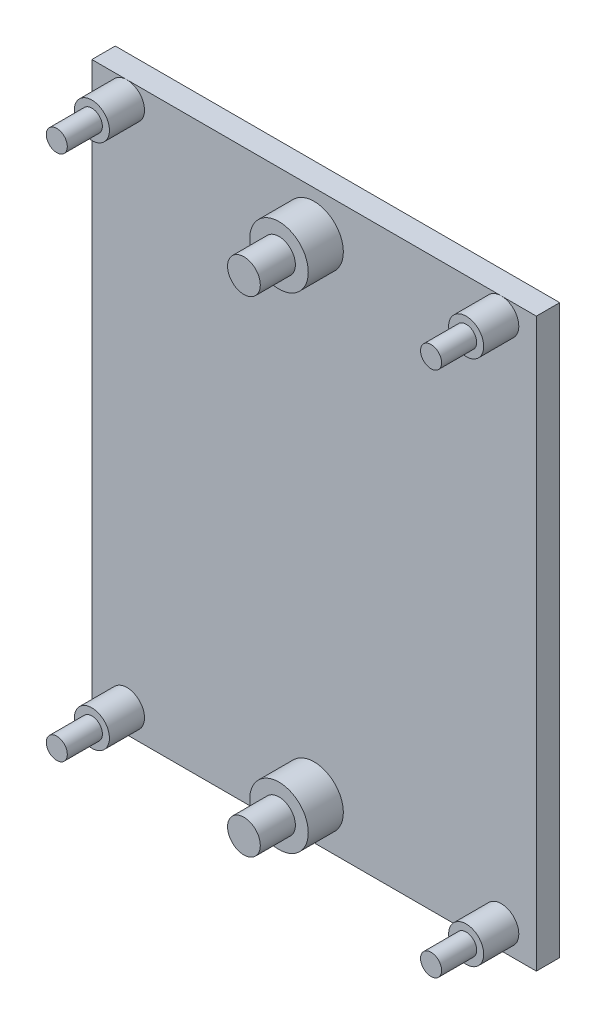
ISO-10303-21;
HEADER;
FILE_DESCRIPTION(('STEP AP214'),'2;1');
FILE_NAME('part.step','',(''),(''),'','','');
FILE_SCHEMA(('AUTOMOTIVE_DESIGN { 1 0 10303 214 1 1 1 1 }'));
ENDSEC;
DATA;
#1=APPLICATION_CONTEXT('core data for automotive mechanical design processes');
#2=APPLICATION_PROTOCOL_DEFINITION('international standard','automotive_design',2000,#1);
#3=PRODUCT_CONTEXT('',#1,'mechanical');
#4=PRODUCT('Part','Part','',(#3));
#5=PRODUCT_RELATED_PRODUCT_CATEGORY('part','',(#4));
#6=PRODUCT_DEFINITION_FORMATION('','',#4);
#7=PRODUCT_DEFINITION_CONTEXT('part definition',#1,'design');
#8=PRODUCT_DEFINITION('design','',#6,#7);
#9=PRODUCT_DEFINITION_SHAPE('','',#8);
#10=(LENGTH_UNIT() NAMED_UNIT(*) SI_UNIT(.MILLI.,.METRE.));
#11=(NAMED_UNIT(*) PLANE_ANGLE_UNIT() SI_UNIT($,.RADIAN.));
#12=(NAMED_UNIT(*) SI_UNIT($,.STERADIAN.) SOLID_ANGLE_UNIT());
#13=UNCERTAINTY_MEASURE_WITH_UNIT(LENGTH_MEASURE(1.E-05),#10,'distance_accuracy_value','');
#14=(GEOMETRIC_REPRESENTATION_CONTEXT(3) GLOBAL_UNCERTAINTY_ASSIGNED_CONTEXT((#13)) GLOBAL_UNIT_ASSIGNED_CONTEXT((#10,
#11,#12)) REPRESENTATION_CONTEXT('',''));
#15=CARTESIAN_POINT('',(0.,0.,0.));
#16=DIRECTION('',(0.,0.,1.));
#17=DIRECTION('',(1.,0.,0.));
#18=AXIS2_PLACEMENT_3D('',#15,#16,#17);
#19=CARTESIAN_POINT('',(19.,-24.25,2.));
#20=DIRECTION('',(-1.,0.,0.));
#21=DIRECTION('',(0.,0.,1.));
#22=AXIS2_PLACEMENT_3D('',#19,#20,#21);
#23=PLANE('',#22);
#24=DIRECTION('',(0.,1.,0.));
#25=VECTOR('',#24,1.);
#26=CARTESIAN_POINT('',(19.,-24.25,0.));
#27=LINE('',#26,#25);
#28=CARTESIAN_POINT('',(19.,-24.25,0.));
#29=VERTEX_POINT('',#28);
#30=CARTESIAN_POINT('',(19.,24.25,0.));
#31=VERTEX_POINT('',#30);
#32=EDGE_CURVE('E127',#29,#31,#27,.T.);
#33=ORIENTED_EDGE('',*,*,#32,.T.);
#34=DIRECTION('',(0.,0.,-1.));
#35=VECTOR('',#34,1.);
#36=CARTESIAN_POINT('',(19.,24.25,2.));
#37=LINE('',#36,#35);
#38=CARTESIAN_POINT('',(19.,24.25,2.));
#39=VERTEX_POINT('',#38);
#40=EDGE_CURVE('E46',#39,#31,#37,.T.);
#41=ORIENTED_EDGE('',*,*,#40,.F.);
#42=DIRECTION('',(0.,1.,0.));
#43=VECTOR('',#42,1.);
#44=CARTESIAN_POINT('',(19.,-24.25,2.));
#45=LINE('',#44,#43);
#46=CARTESIAN_POINT('',(19.,-24.25,2.));
#47=VERTEX_POINT('',#46);
#48=EDGE_CURVE('E112',#47,#39,#45,.T.);
#49=ORIENTED_EDGE('',*,*,#48,.F.);
#50=DIRECTION('',(0.,0.,-1.));
#51=VECTOR('',#50,1.);
#52=CARTESIAN_POINT('',(19.,-24.25,2.));
#53=LINE('',#52,#51);
#54=EDGE_CURVE('E62',#47,#29,#53,.T.);
#55=ORIENTED_EDGE('',*,*,#54,.T.);
#56=EDGE_LOOP('',(#33,#41,#49,#55));
#57=FACE_BOUND('',#56,.T.);
#58=ADVANCED_FACE('F43',(#57),#23,.F.);
#59=CARTESIAN_POINT('',(19.,24.25,2.));
#60=DIRECTION('',(0.,-1.,0.));
#61=DIRECTION('',(0.,0.,-1.));
#62=AXIS2_PLACEMENT_3D('',#59,#60,#61);
#63=PLANE('',#62);
#64=DIRECTION('',(-1.,0.,0.));
#65=VECTOR('',#64,1.);
#66=CARTESIAN_POINT('',(19.,24.25,0.));
#67=LINE('',#66,#65);
#68=CARTESIAN_POINT('',(-19.,24.25,0.));
#69=VERTEX_POINT('',#68);
#70=EDGE_CURVE('E129',#31,#69,#67,.T.);
#71=ORIENTED_EDGE('',*,*,#70,.T.);
#72=DIRECTION('',(0.,0.,-1.));
#73=VECTOR('',#72,1.);
#74=CARTESIAN_POINT('',(-19.,24.25,2.));
#75=LINE('',#74,#73);
#76=CARTESIAN_POINT('',(-19.,24.25,2.));
#77=VERTEX_POINT('',#76);
#78=EDGE_CURVE('E111',#77,#69,#75,.T.);
#79=ORIENTED_EDGE('',*,*,#78,.F.);
#80=DIRECTION('',(-1.,0.,0.));
#81=VECTOR('',#80,1.);
#82=CARTESIAN_POINT('',(19.,24.25,2.));
#83=LINE('',#82,#81);
#84=CARTESIAN_POINT('',(-16.,24.25,2.));
#85=VERTEX_POINT('',#84);
#86=EDGE_CURVE('E106',#85,#77,#83,.T.);
#87=ORIENTED_EDGE('',*,*,#86,.F.);
#88=CARTESIAN_POINT('',(16.,24.25,2.));
#89=VERTEX_POINT('',#88);
#90=EDGE_CURVE('E96',#89,#85,#83,.T.);
#91=ORIENTED_EDGE('',*,*,#90,.F.);
#92=EDGE_CURVE('E90',#39,#89,#83,.T.);
#93=ORIENTED_EDGE('',*,*,#92,.F.);
#94=ORIENTED_EDGE('',*,*,#40,.T.);
#95=EDGE_LOOP('',(#71,#79,#87,#91,#93,#94));
#96=FACE_BOUND('',#95,.T.);
#97=ADVANCED_FACE('F109',(#96),#63,.F.);
#98=CARTESIAN_POINT('',(-19.,-24.25,2.));
#99=DIRECTION('',(-1.,0.,0.));
#100=DIRECTION('',(0.,0.,1.));
#101=AXIS2_PLACEMENT_3D('',#98,#99,#100);
#102=PLANE('',#101);
#103=DIRECTION('',(0.,1.,0.));
#104=VECTOR('',#103,1.);
#105=CARTESIAN_POINT('',(-19.,-24.25,0.));
#106=LINE('',#105,#104);
#107=CARTESIAN_POINT('',(-19.,-24.25,0.));
#108=VERTEX_POINT('',#107);
#109=EDGE_CURVE('E131',#108,#69,#106,.T.);
#110=ORIENTED_EDGE('',*,*,#109,.F.);
#111=DIRECTION('',(0.,0.,-1.));
#112=VECTOR('',#111,1.);
#113=CARTESIAN_POINT('',(-19.,-24.25,2.));
#114=LINE('',#113,#112);
#115=CARTESIAN_POINT('',(-19.,-24.25,2.));
#116=VERTEX_POINT('',#115);
#117=EDGE_CURVE('E77',#116,#108,#114,.T.);
#118=ORIENTED_EDGE('',*,*,#117,.F.);
#119=DIRECTION('',(0.,1.,0.));
#120=VECTOR('',#119,1.);
#121=CARTESIAN_POINT('',(-19.,-24.25,2.));
#122=LINE('',#121,#120);
#123=EDGE_CURVE('E117',#116,#77,#122,.T.);
#124=ORIENTED_EDGE('',*,*,#123,.T.);
#125=ORIENTED_EDGE('',*,*,#78,.T.);
#126=EDGE_LOOP('',(#110,#118,#124,#125));
#127=FACE_BOUND('',#126,.T.);
#128=ADVANCED_FACE('F256',(#127),#102,.T.);
#129=CARTESIAN_POINT('',(19.,-24.25,2.));
#130=DIRECTION('',(0.,-1.,0.));
#131=DIRECTION('',(0.,0.,-1.));
#132=AXIS2_PLACEMENT_3D('',#129,#130,#131);
#133=PLANE('',#132);
#134=DIRECTION('',(-1.,0.,0.));
#135=VECTOR('',#134,1.);
#136=CARTESIAN_POINT('',(19.,-24.25,0.));
#137=LINE('',#136,#135);
#138=EDGE_CURVE('E114',#29,#108,#137,.T.);
#139=ORIENTED_EDGE('',*,*,#138,.F.);
#140=ORIENTED_EDGE('',*,*,#54,.F.);
#141=DIRECTION('',(-1.,0.,0.));
#142=VECTOR('',#141,1.);
#143=CARTESIAN_POINT('',(19.,-24.25,2.));
#144=LINE('',#143,#142);
#145=EDGE_CURVE('E119',#47,#116,#144,.T.);
#146=ORIENTED_EDGE('',*,*,#145,.T.);
#147=ORIENTED_EDGE('',*,*,#117,.T.);
#148=EDGE_LOOP('',(#139,#140,#146,#147));
#149=FACE_BOUND('',#148,.T.);
#150=ADVANCED_FACE('F227',(#149),#133,.T.);
#151=CARTESIAN_POINT('',(0.,0.,2.));
#152=DIRECTION('',(0.,0.,1.));
#153=DIRECTION('',(1.,0.,0.));
#154=AXIS2_PLACEMENT_3D('',#151,#152,#153);
#155=PLANE('',#154);
#156=CARTESIAN_POINT('',(16.,-22.25,2.));
#157=DIRECTION('',(0.,0.,1.));
#158=DIRECTION('',(1.,0.,0.));
#159=AXIS2_PLACEMENT_3D('',#156,#157,#158);
#160=CIRCLE('',#159,1.5);
#161=CARTESIAN_POINT('',(17.5,-22.25,2.));
#162=VERTEX_POINT('',#161);
#163=EDGE_CURVE('E157',#162,#162,#160,.T.);
#164=ORIENTED_EDGE('',*,*,#163,.F.);
#165=EDGE_LOOP('',(#164));
#166=FACE_BOUND('',#165,.T.);
#167=CARTESIAN_POINT('',(0.,-20.75,2.));
#168=DIRECTION('',(0.,0.,1.));
#169=DIRECTION('',(1.,0.,0.));
#170=AXIS2_PLACEMENT_3D('',#167,#168,#169);
#171=CIRCLE('',#170,2.5);
#172=CARTESIAN_POINT('',(2.5,-20.75,2.));
#173=VERTEX_POINT('',#172);
#174=EDGE_CURVE('E150',#173,#173,#171,.T.);
#175=ORIENTED_EDGE('',*,*,#174,.F.);
#176=EDGE_LOOP('',(#175));
#177=FACE_BOUND('',#176,.T.);
#178=CARTESIAN_POINT('',(0.,20.75,2.));
#179=DIRECTION('',(0.,0.,1.));
#180=DIRECTION('',(1.,0.,0.));
#181=AXIS2_PLACEMENT_3D('',#178,#179,#180);
#182=CIRCLE('',#181,2.5);
#183=CARTESIAN_POINT('',(2.5,20.75,2.));
#184=VERTEX_POINT('',#183);
#185=EDGE_CURVE('E145',#184,#184,#182,.T.);
#186=ORIENTED_EDGE('',*,*,#185,.F.);
#187=EDGE_LOOP('',(#186));
#188=FACE_BOUND('',#187,.T.);
#189=CARTESIAN_POINT('',(-16.,-22.25,2.));
#190=DIRECTION('',(0.,0.,1.));
#191=DIRECTION('',(1.,0.,0.));
#192=AXIS2_PLACEMENT_3D('',#189,#190,#191);
#193=CIRCLE('',#192,1.5);
#194=CARTESIAN_POINT('',(-14.5,-22.25,2.));
#195=VERTEX_POINT('',#194);
#196=EDGE_CURVE('E139',#195,#195,#193,.T.);
#197=ORIENTED_EDGE('',*,*,#196,.F.);
#198=EDGE_LOOP('',(#197));
#199=FACE_BOUND('',#198,.T.);
#200=ORIENTED_EDGE('',*,*,#92,.T.);
#201=CARTESIAN_POINT('',(16.,22.75,2.));
#202=DIRECTION('',(0.,0.,1.));
#203=DIRECTION('',(1.,0.,0.));
#204=AXIS2_PLACEMENT_3D('',#201,#202,#203);
#205=CIRCLE('',#204,1.5);
#206=EDGE_CURVE('E104',#89,#89,#205,.T.);
#207=ORIENTED_EDGE('',*,*,#206,.F.);
#208=ORIENTED_EDGE('',*,*,#90,.T.);
#209=CARTESIAN_POINT('',(-16.,22.75,2.));
#210=DIRECTION('',(0.,0.,1.));
#211=DIRECTION('',(1.,0.,0.));
#212=AXIS2_PLACEMENT_3D('',#209,#210,#211);
#213=CIRCLE('',#212,1.5);
#214=EDGE_CURVE('E105',#85,#85,#213,.T.);
#215=ORIENTED_EDGE('',*,*,#214,.F.);
#216=ORIENTED_EDGE('',*,*,#86,.T.);
#217=ORIENTED_EDGE('',*,*,#123,.F.);
#218=ORIENTED_EDGE('',*,*,#145,.F.);
#219=ORIENTED_EDGE('',*,*,#48,.T.);
#220=EDGE_LOOP('',(#200,#207,#208,#215,#216,#217,#218,#219));
#221=FACE_BOUND('',#220,.T.);
#222=ADVANCED_FACE('F99',(#166,#177,#188,#199,#221),#155,.T.);
#223=CARTESIAN_POINT('',(0.,0.,0.));
#224=DIRECTION('',(0.,0.,1.));
#225=DIRECTION('',(1.,0.,0.));
#226=AXIS2_PLACEMENT_3D('',#223,#224,#225);
#227=PLANE('',#226);
#228=ORIENTED_EDGE('',*,*,#32,.F.);
#229=ORIENTED_EDGE('',*,*,#138,.T.);
#230=ORIENTED_EDGE('',*,*,#109,.T.);
#231=ORIENTED_EDGE('',*,*,#70,.F.);
#232=EDGE_LOOP('',(#228,#229,#230,#231));
#233=FACE_BOUND('',#232,.T.);
#234=ADVANCED_FACE('F228',(#233),#227,.F.);
#235=CARTESIAN_POINT('',(-16.,-22.25,5.));
#236=DIRECTION('',(0.,0.,-1.));
#237=DIRECTION('',(-1.,0.,0.));
#238=AXIS2_PLACEMENT_3D('',#235,#236,#237);
#239=CYLINDRICAL_SURFACE('',#238,1.5);
#240=CARTESIAN_POINT('',(-16.,-22.25,5.));
#241=DIRECTION('',(0.,0.,1.));
#242=DIRECTION('',(1.,0.,0.));
#243=AXIS2_PLACEMENT_3D('',#240,#241,#242);
#244=CIRCLE('',#243,1.5);
#245=CARTESIAN_POINT('',(-14.5,-22.25,5.));
#246=VERTEX_POINT('',#245);
#247=EDGE_CURVE('E126',#246,#246,#244,.T.);
#248=ORIENTED_EDGE('',*,*,#247,.F.);
#249=EDGE_LOOP('',(#248));
#250=FACE_BOUND('',#249,.T.);
#251=ORIENTED_EDGE('',*,*,#196,.T.);
#252=EDGE_LOOP('',(#251));
#253=FACE_BOUND('',#252,.T.);
#254=ADVANCED_FACE('F248',(#250,#253),#239,.T.);
#255=CARTESIAN_POINT('',(-16.,-22.25,5.));
#256=DIRECTION('',(0.,0.,1.));
#257=DIRECTION('',(1.,0.,0.));
#258=AXIS2_PLACEMENT_3D('',#255,#256,#257);
#259=PLANE('',#258);
#260=CARTESIAN_POINT('',(-16.,-22.25,5.));
#261=DIRECTION('',(0.,0.,1.));
#262=DIRECTION('',(1.,0.,0.));
#263=AXIS2_PLACEMENT_3D('',#260,#261,#262);
#264=CIRCLE('',#263,0.900000000000002);
#265=CARTESIAN_POINT('',(-15.1,-22.25,5.));
#266=VERTEX_POINT('',#265);
#267=EDGE_CURVE('E11',#266,#266,#264,.T.);
#268=ORIENTED_EDGE('',*,*,#267,.F.);
#269=EDGE_LOOP('',(#268));
#270=FACE_BOUND('',#269,.T.);
#271=ORIENTED_EDGE('',*,*,#247,.T.);
#272=EDGE_LOOP('',(#271));
#273=FACE_BOUND('',#272,.T.);
#274=ADVANCED_FACE('F240',(#270,#273),#259,.T.);
#275=CARTESIAN_POINT('',(0.,20.75,5.));
#276=DIRECTION('',(0.,0.,-1.));
#277=DIRECTION('',(-1.,0.,0.));
#278=AXIS2_PLACEMENT_3D('',#275,#276,#277);
#279=CYLINDRICAL_SURFACE('',#278,2.5);
#280=CARTESIAN_POINT('',(0.,20.75,5.));
#281=DIRECTION('',(0.,0.,1.));
#282=DIRECTION('',(1.,0.,0.));
#283=AXIS2_PLACEMENT_3D('',#280,#281,#282);
#284=CIRCLE('',#283,2.5);
#285=CARTESIAN_POINT('',(2.5,20.75,5.));
#286=VERTEX_POINT('',#285);
#287=EDGE_CURVE('E160',#286,#286,#284,.T.);
#288=ORIENTED_EDGE('',*,*,#287,.F.);
#289=EDGE_LOOP('',(#288));
#290=FACE_BOUND('',#289,.T.);
#291=ORIENTED_EDGE('',*,*,#185,.T.);
#292=EDGE_LOOP('',(#291));
#293=FACE_BOUND('',#292,.T.);
#294=ADVANCED_FACE('F234',(#290,#293),#279,.T.);
#295=CARTESIAN_POINT('',(0.,20.75,5.));
#296=DIRECTION('',(0.,0.,1.));
#297=DIRECTION('',(1.,0.,0.));
#298=AXIS2_PLACEMENT_3D('',#295,#296,#297);
#299=PLANE('',#298);
#300=CARTESIAN_POINT('',(0.,20.75,5.));
#301=DIRECTION('',(0.,0.,1.));
#302=DIRECTION('',(1.,0.,0.));
#303=AXIS2_PLACEMENT_3D('',#300,#301,#302);
#304=CIRCLE('',#303,1.4);
#305=CARTESIAN_POINT('',(1.4,20.75,5.));
#306=VERTEX_POINT('',#305);
#307=EDGE_CURVE('E55',#306,#306,#304,.T.);
#308=ORIENTED_EDGE('',*,*,#307,.F.);
#309=EDGE_LOOP('',(#308));
#310=FACE_BOUND('',#309,.T.);
#311=ORIENTED_EDGE('',*,*,#287,.T.);
#312=EDGE_LOOP('',(#311));
#313=FACE_BOUND('',#312,.T.);
#314=ADVANCED_FACE('F236',(#310,#313),#299,.T.);
#315=CARTESIAN_POINT('',(0.,-20.75,5.));
#316=DIRECTION('',(0.,0.,-1.));
#317=DIRECTION('',(-1.,0.,0.));
#318=AXIS2_PLACEMENT_3D('',#315,#316,#317);
#319=CYLINDRICAL_SURFACE('',#318,2.5);
#320=CARTESIAN_POINT('',(0.,-20.75,5.));
#321=DIRECTION('',(0.,0.,1.));
#322=DIRECTION('',(1.,0.,0.));
#323=AXIS2_PLACEMENT_3D('',#320,#321,#322);
#324=CIRCLE('',#323,2.5);
#325=CARTESIAN_POINT('',(2.5,-20.75,5.));
#326=VERTEX_POINT('',#325);
#327=EDGE_CURVE('E155',#326,#326,#324,.T.);
#328=ORIENTED_EDGE('',*,*,#327,.F.);
#329=EDGE_LOOP('',(#328));
#330=FACE_BOUND('',#329,.T.);
#331=ORIENTED_EDGE('',*,*,#174,.T.);
#332=EDGE_LOOP('',(#331));
#333=FACE_BOUND('',#332,.T.);
#334=ADVANCED_FACE('F244',(#330,#333),#319,.T.);
#335=CARTESIAN_POINT('',(0.,-20.75,5.));
#336=DIRECTION('',(0.,0.,1.));
#337=DIRECTION('',(1.,0.,0.));
#338=AXIS2_PLACEMENT_3D('',#335,#336,#337);
#339=PLANE('',#338);
#340=CARTESIAN_POINT('',(0.,-20.75,5.));
#341=DIRECTION('',(0.,0.,1.));
#342=DIRECTION('',(1.,0.,0.));
#343=AXIS2_PLACEMENT_3D('',#340,#341,#342);
#344=CIRCLE('',#343,1.4);
#345=CARTESIAN_POINT('',(1.4,-20.75,5.));
#346=VERTEX_POINT('',#345);
#347=EDGE_CURVE('E178',#346,#346,#344,.T.);
#348=ORIENTED_EDGE('',*,*,#347,.F.);
#349=EDGE_LOOP('',(#348));
#350=FACE_BOUND('',#349,.T.);
#351=ORIENTED_EDGE('',*,*,#327,.T.);
#352=EDGE_LOOP('',(#351));
#353=FACE_BOUND('',#352,.T.);
#354=ADVANCED_FACE('F275',(#350,#353),#339,.T.);
#355=CARTESIAN_POINT('',(-16.,22.75,5.));
#356=DIRECTION('',(0.,0.,-1.));
#357=DIRECTION('',(-1.,0.,0.));
#358=AXIS2_PLACEMENT_3D('',#355,#356,#357);
#359=CYLINDRICAL_SURFACE('',#358,1.5);
#360=CARTESIAN_POINT('',(-16.,22.75,5.));
#361=DIRECTION('',(0.,0.,1.));
#362=DIRECTION('',(1.,0.,0.));
#363=AXIS2_PLACEMENT_3D('',#360,#361,#362);
#364=CIRCLE('',#363,1.5);
#365=CARTESIAN_POINT('',(-14.5,22.75,5.));
#366=VERTEX_POINT('',#365);
#367=EDGE_CURVE('E158',#366,#366,#364,.T.);
#368=ORIENTED_EDGE('',*,*,#367,.F.);
#369=EDGE_LOOP('',(#368));
#370=FACE_BOUND('',#369,.T.);
#371=ORIENTED_EDGE('',*,*,#214,.T.);
#372=EDGE_LOOP('',(#371));
#373=FACE_BOUND('',#372,.T.);
#374=ADVANCED_FACE('F273',(#370,#373),#359,.T.);
#375=CARTESIAN_POINT('',(-16.,22.75,5.));
#376=DIRECTION('',(0.,0.,1.));
#377=DIRECTION('',(1.,0.,0.));
#378=AXIS2_PLACEMENT_3D('',#375,#376,#377);
#379=PLANE('',#378);
#380=CARTESIAN_POINT('',(-16.,22.75,5.));
#381=DIRECTION('',(0.,0.,1.));
#382=DIRECTION('',(1.,0.,0.));
#383=AXIS2_PLACEMENT_3D('',#380,#381,#382);
#384=CIRCLE('',#383,0.900000000000002);
#385=CARTESIAN_POINT('',(-15.1,22.75,5.));
#386=VERTEX_POINT('',#385);
#387=EDGE_CURVE('E195',#386,#386,#384,.T.);
#388=ORIENTED_EDGE('',*,*,#387,.F.);
#389=EDGE_LOOP('',(#388));
#390=FACE_BOUND('',#389,.T.);
#391=ORIENTED_EDGE('',*,*,#367,.T.);
#392=EDGE_LOOP('',(#391));
#393=FACE_BOUND('',#392,.T.);
#394=ADVANCED_FACE('F276',(#390,#393),#379,.T.);
#395=CARTESIAN_POINT('',(16.,22.75,5.));
#396=DIRECTION('',(0.,0.,-1.));
#397=DIRECTION('',(-1.,0.,0.));
#398=AXIS2_PLACEMENT_3D('',#395,#396,#397);
#399=CYLINDRICAL_SURFACE('',#398,1.5);
#400=CARTESIAN_POINT('',(16.,22.75,5.));
#401=DIRECTION('',(0.,0.,1.));
#402=DIRECTION('',(1.,0.,0.));
#403=AXIS2_PLACEMENT_3D('',#400,#401,#402);
#404=CIRCLE('',#403,1.5);
#405=CARTESIAN_POINT('',(17.5,22.75,5.));
#406=VERTEX_POINT('',#405);
#407=EDGE_CURVE('E165',#406,#406,#404,.T.);
#408=ORIENTED_EDGE('',*,*,#407,.F.);
#409=EDGE_LOOP('',(#408));
#410=FACE_BOUND('',#409,.T.);
#411=ORIENTED_EDGE('',*,*,#206,.T.);
#412=EDGE_LOOP('',(#411));
#413=FACE_BOUND('',#412,.T.);
#414=ADVANCED_FACE('F281',(#410,#413),#399,.T.);
#415=CARTESIAN_POINT('',(16.,22.75,5.));
#416=DIRECTION('',(0.,0.,1.));
#417=DIRECTION('',(1.,0.,0.));
#418=AXIS2_PLACEMENT_3D('',#415,#416,#417);
#419=PLANE('',#418);
#420=CARTESIAN_POINT('',(16.,22.75,5.));
#421=DIRECTION('',(0.,0.,1.));
#422=DIRECTION('',(1.,0.,0.));
#423=AXIS2_PLACEMENT_3D('',#420,#421,#422);
#424=CIRCLE('',#423,0.900000000000001);
#425=CARTESIAN_POINT('',(16.9,22.75,5.));
#426=VERTEX_POINT('',#425);
#427=EDGE_CURVE('E198',#426,#426,#424,.T.);
#428=ORIENTED_EDGE('',*,*,#427,.F.);
#429=EDGE_LOOP('',(#428));
#430=FACE_BOUND('',#429,.T.);
#431=ORIENTED_EDGE('',*,*,#407,.T.);
#432=EDGE_LOOP('',(#431));
#433=FACE_BOUND('',#432,.T.);
#434=ADVANCED_FACE('F217',(#430,#433),#419,.T.);
#435=CARTESIAN_POINT('',(16.,-22.25,5.));
#436=DIRECTION('',(0.,0.,-1.));
#437=DIRECTION('',(-1.,0.,0.));
#438=AXIS2_PLACEMENT_3D('',#435,#436,#437);
#439=CYLINDRICAL_SURFACE('',#438,1.5);
#440=CARTESIAN_POINT('',(16.,-22.25,5.));
#441=DIRECTION('',(0.,0.,1.));
#442=DIRECTION('',(1.,0.,0.));
#443=AXIS2_PLACEMENT_3D('',#440,#441,#442);
#444=CIRCLE('',#443,1.5);
#445=CARTESIAN_POINT('',(17.5,-22.25,5.));
#446=VERTEX_POINT('',#445);
#447=EDGE_CURVE('E151',#446,#446,#444,.T.);
#448=ORIENTED_EDGE('',*,*,#447,.F.);
#449=EDGE_LOOP('',(#448));
#450=FACE_BOUND('',#449,.T.);
#451=ORIENTED_EDGE('',*,*,#163,.T.);
#452=EDGE_LOOP('',(#451));
#453=FACE_BOUND('',#452,.T.);
#454=ADVANCED_FACE('F211',(#450,#453),#439,.T.);
#455=CARTESIAN_POINT('',(16.,-22.25,5.));
#456=DIRECTION('',(0.,0.,1.));
#457=DIRECTION('',(1.,0.,0.));
#458=AXIS2_PLACEMENT_3D('',#455,#456,#457);
#459=PLANE('',#458);
#460=CARTESIAN_POINT('',(16.,-22.25,5.));
#461=DIRECTION('',(0.,0.,1.));
#462=DIRECTION('',(1.,0.,0.));
#463=AXIS2_PLACEMENT_3D('',#460,#461,#462);
#464=CIRCLE('',#463,0.900000000000001);
#465=CARTESIAN_POINT('',(16.9,-22.25,5.));
#466=VERTEX_POINT('',#465);
#467=EDGE_CURVE('E175',#466,#466,#464,.T.);
#468=ORIENTED_EDGE('',*,*,#467,.F.);
#469=EDGE_LOOP('',(#468));
#470=FACE_BOUND('',#469,.T.);
#471=ORIENTED_EDGE('',*,*,#447,.T.);
#472=EDGE_LOOP('',(#471));
#473=FACE_BOUND('',#472,.T.);
#474=ADVANCED_FACE('F212',(#470,#473),#459,.T.);
#475=CARTESIAN_POINT('',(16.,-22.25,8.));
#476=DIRECTION('',(0.,0.,-1.));
#477=DIRECTION('',(-1.,0.,0.));
#478=AXIS2_PLACEMENT_3D('',#475,#476,#477);
#479=CYLINDRICAL_SURFACE('',#478,0.900000000000001);
#480=CARTESIAN_POINT('',(16.,-22.25,8.));
#481=DIRECTION('',(0.,0.,1.));
#482=DIRECTION('',(1.,0.,0.));
#483=AXIS2_PLACEMENT_3D('',#480,#481,#482);
#484=CIRCLE('',#483,0.900000000000001);
#485=CARTESIAN_POINT('',(16.9,-22.25,8.));
#486=VERTEX_POINT('',#485);
#487=EDGE_CURVE('E184',#486,#486,#484,.T.);
#488=ORIENTED_EDGE('',*,*,#487,.F.);
#489=EDGE_LOOP('',(#488));
#490=FACE_BOUND('',#489,.T.);
#491=ORIENTED_EDGE('',*,*,#467,.T.);
#492=EDGE_LOOP('',(#491));
#493=FACE_BOUND('',#492,.T.);
#494=ADVANCED_FACE('F209',(#490,#493),#479,.T.);
#495=CARTESIAN_POINT('',(16.,-22.25,8.));
#496=DIRECTION('',(0.,0.,1.));
#497=DIRECTION('',(1.,0.,0.));
#498=AXIS2_PLACEMENT_3D('',#495,#496,#497);
#499=PLANE('',#498);
#500=ORIENTED_EDGE('',*,*,#487,.T.);
#501=EDGE_LOOP('',(#500));
#502=FACE_BOUND('',#501,.T.);
#503=ADVANCED_FACE('F344',(#502),#499,.T.);
#504=CARTESIAN_POINT('',(16.,22.75,8.));
#505=DIRECTION('',(0.,0.,-1.));
#506=DIRECTION('',(-1.,0.,0.));
#507=AXIS2_PLACEMENT_3D('',#504,#505,#506);
#508=CYLINDRICAL_SURFACE('',#507,0.900000000000001);
#509=CARTESIAN_POINT('',(16.,22.75,8.));
#510=DIRECTION('',(0.,0.,1.));
#511=DIRECTION('',(1.,0.,0.));
#512=AXIS2_PLACEMENT_3D('',#509,#510,#511);
#513=CIRCLE('',#512,0.900000000000001);
#514=CARTESIAN_POINT('',(16.9,22.75,8.));
#515=VERTEX_POINT('',#514);
#516=EDGE_CURVE('E181',#515,#515,#513,.T.);
#517=ORIENTED_EDGE('',*,*,#516,.F.);
#518=EDGE_LOOP('',(#517));
#519=FACE_BOUND('',#518,.T.);
#520=ORIENTED_EDGE('',*,*,#427,.T.);
#521=EDGE_LOOP('',(#520));
#522=FACE_BOUND('',#521,.T.);
#523=ADVANCED_FACE('F355',(#519,#522),#508,.T.);
#524=CARTESIAN_POINT('',(16.,22.75,8.));
#525=DIRECTION('',(0.,0.,1.));
#526=DIRECTION('',(1.,0.,0.));
#527=AXIS2_PLACEMENT_3D('',#524,#525,#526);
#528=PLANE('',#527);
#529=ORIENTED_EDGE('',*,*,#516,.T.);
#530=EDGE_LOOP('',(#529));
#531=FACE_BOUND('',#530,.T.);
#532=ADVANCED_FACE('F363',(#531),#528,.T.);
#533=CARTESIAN_POINT('',(-16.,22.75,8.));
#534=DIRECTION('',(0.,0.,-1.));
#535=DIRECTION('',(-1.,0.,0.));
#536=AXIS2_PLACEMENT_3D('',#533,#534,#535);
#537=CYLINDRICAL_SURFACE('',#536,0.900000000000002);
#538=CARTESIAN_POINT('',(-16.,22.75,8.));
#539=DIRECTION('',(0.,0.,1.));
#540=DIRECTION('',(1.,0.,0.));
#541=AXIS2_PLACEMENT_3D('',#538,#539,#540);
#542=CIRCLE('',#541,0.900000000000002);
#543=CARTESIAN_POINT('',(-15.1,22.75,8.));
#544=VERTEX_POINT('',#543);
#545=EDGE_CURVE('E186',#544,#544,#542,.T.);
#546=ORIENTED_EDGE('',*,*,#545,.F.);
#547=EDGE_LOOP('',(#546));
#548=FACE_BOUND('',#547,.T.);
#549=ORIENTED_EDGE('',*,*,#387,.T.);
#550=EDGE_LOOP('',(#549));
#551=FACE_BOUND('',#550,.T.);
#552=ADVANCED_FACE('F369',(#548,#551),#537,.T.);
#553=CARTESIAN_POINT('',(-16.,22.75,8.));
#554=DIRECTION('',(0.,0.,1.));
#555=DIRECTION('',(1.,0.,0.));
#556=AXIS2_PLACEMENT_3D('',#553,#554,#555);
#557=PLANE('',#556);
#558=ORIENTED_EDGE('',*,*,#545,.T.);
#559=EDGE_LOOP('',(#558));
#560=FACE_BOUND('',#559,.T.);
#561=ADVANCED_FACE('F378',(#560),#557,.T.);
#562=CARTESIAN_POINT('',(0.,-20.75,8.));
#563=DIRECTION('',(0.,0.,-1.));
#564=DIRECTION('',(-1.,0.,0.));
#565=AXIS2_PLACEMENT_3D('',#562,#563,#564);
#566=CYLINDRICAL_SURFACE('',#565,1.4);
#567=CARTESIAN_POINT('',(0.,-20.75,8.));
#568=DIRECTION('',(0.,0.,1.));
#569=DIRECTION('',(1.,0.,0.));
#570=AXIS2_PLACEMENT_3D('',#567,#568,#569);
#571=CIRCLE('',#570,1.4);
#572=CARTESIAN_POINT('',(1.4,-20.75,8.));
#573=VERTEX_POINT('',#572);
#574=EDGE_CURVE('E183',#573,#573,#571,.T.);
#575=ORIENTED_EDGE('',*,*,#574,.F.);
#576=EDGE_LOOP('',(#575));
#577=FACE_BOUND('',#576,.T.);
#578=ORIENTED_EDGE('',*,*,#347,.T.);
#579=EDGE_LOOP('',(#578));
#580=FACE_BOUND('',#579,.T.);
#581=ADVANCED_FACE('F389',(#577,#580),#566,.T.);
#582=CARTESIAN_POINT('',(0.,-20.75,8.));
#583=DIRECTION('',(0.,0.,1.));
#584=DIRECTION('',(1.,0.,0.));
#585=AXIS2_PLACEMENT_3D('',#582,#583,#584);
#586=PLANE('',#585);
#587=ORIENTED_EDGE('',*,*,#574,.T.);
#588=EDGE_LOOP('',(#587));
#589=FACE_BOUND('',#588,.T.);
#590=ADVANCED_FACE('F400',(#589),#586,.T.);
#591=CARTESIAN_POINT('',(0.,20.75,8.));
#592=DIRECTION('',(0.,0.,-1.));
#593=DIRECTION('',(-1.,0.,0.));
#594=AXIS2_PLACEMENT_3D('',#591,#592,#593);
#595=CYLINDRICAL_SURFACE('',#594,1.4);
#596=CARTESIAN_POINT('',(0.,20.75,8.));
#597=DIRECTION('',(0.,0.,1.));
#598=DIRECTION('',(1.,0.,0.));
#599=AXIS2_PLACEMENT_3D('',#596,#597,#598);
#600=CIRCLE('',#599,1.4);
#601=CARTESIAN_POINT('',(1.4,20.75,8.));
#602=VERTEX_POINT('',#601);
#603=EDGE_CURVE('E172',#602,#602,#600,.T.);
#604=ORIENTED_EDGE('',*,*,#603,.F.);
#605=EDGE_LOOP('',(#604));
#606=FACE_BOUND('',#605,.T.);
#607=ORIENTED_EDGE('',*,*,#307,.T.);
#608=EDGE_LOOP('',(#607));
#609=FACE_BOUND('',#608,.T.);
#610=ADVANCED_FACE('F407',(#606,#609),#595,.T.);
#611=CARTESIAN_POINT('',(0.,20.75,8.));
#612=DIRECTION('',(0.,0.,1.));
#613=DIRECTION('',(1.,0.,0.));
#614=AXIS2_PLACEMENT_3D('',#611,#612,#613);
#615=PLANE('',#614);
#616=ORIENTED_EDGE('',*,*,#603,.T.);
#617=EDGE_LOOP('',(#616));
#618=FACE_BOUND('',#617,.T.);
#619=ADVANCED_FACE('F412',(#618),#615,.T.);
#620=CARTESIAN_POINT('',(-16.,-22.25,8.));
#621=DIRECTION('',(0.,0.,-1.));
#622=DIRECTION('',(-1.,0.,0.));
#623=AXIS2_PLACEMENT_3D('',#620,#621,#622);
#624=CYLINDRICAL_SURFACE('',#623,0.900000000000002);
#625=CARTESIAN_POINT('',(-16.,-22.25,8.));
#626=DIRECTION('',(0.,0.,1.));
#627=DIRECTION('',(1.,0.,0.));
#628=AXIS2_PLACEMENT_3D('',#625,#626,#627);
#629=CIRCLE('',#628,0.900000000000002);
#630=CARTESIAN_POINT('',(-15.1,-22.25,8.));
#631=VERTEX_POINT('',#630);
#632=EDGE_CURVE('E185',#631,#631,#629,.T.);
#633=ORIENTED_EDGE('',*,*,#632,.F.);
#634=EDGE_LOOP('',(#633));
#635=FACE_BOUND('',#634,.T.);
#636=ORIENTED_EDGE('',*,*,#267,.T.);
#637=EDGE_LOOP('',(#636));
#638=FACE_BOUND('',#637,.T.);
#639=ADVANCED_FACE('F421',(#635,#638),#624,.T.);
#640=CARTESIAN_POINT('',(-16.,-22.25,8.));
#641=DIRECTION('',(0.,0.,1.));
#642=DIRECTION('',(1.,0.,0.));
#643=AXIS2_PLACEMENT_3D('',#640,#641,#642);
#644=PLANE('',#643);
#645=ORIENTED_EDGE('',*,*,#632,.T.);
#646=EDGE_LOOP('',(#645));
#647=FACE_BOUND('',#646,.T.);
#648=ADVANCED_FACE('F435',(#647),#644,.T.);
#649=CLOSED_SHELL('',(#58,#97,#128,#150,#222,#234,#254,#274,#294,#314,#334,#354,#374,#394,#414,
#434,#454,#474,#494,#503,#523,#532,#552,#561,#581,#590,#610,#619,#639,#648));
#650=MANIFOLD_SOLID_BREP('B2',#649);
#651=ADVANCED_BREP_SHAPE_REPRESENTATION('',(#18,#650),#14);
#652=SHAPE_DEFINITION_REPRESENTATION(#9,#651);
ENDSEC;
END-ISO-10303-21;
